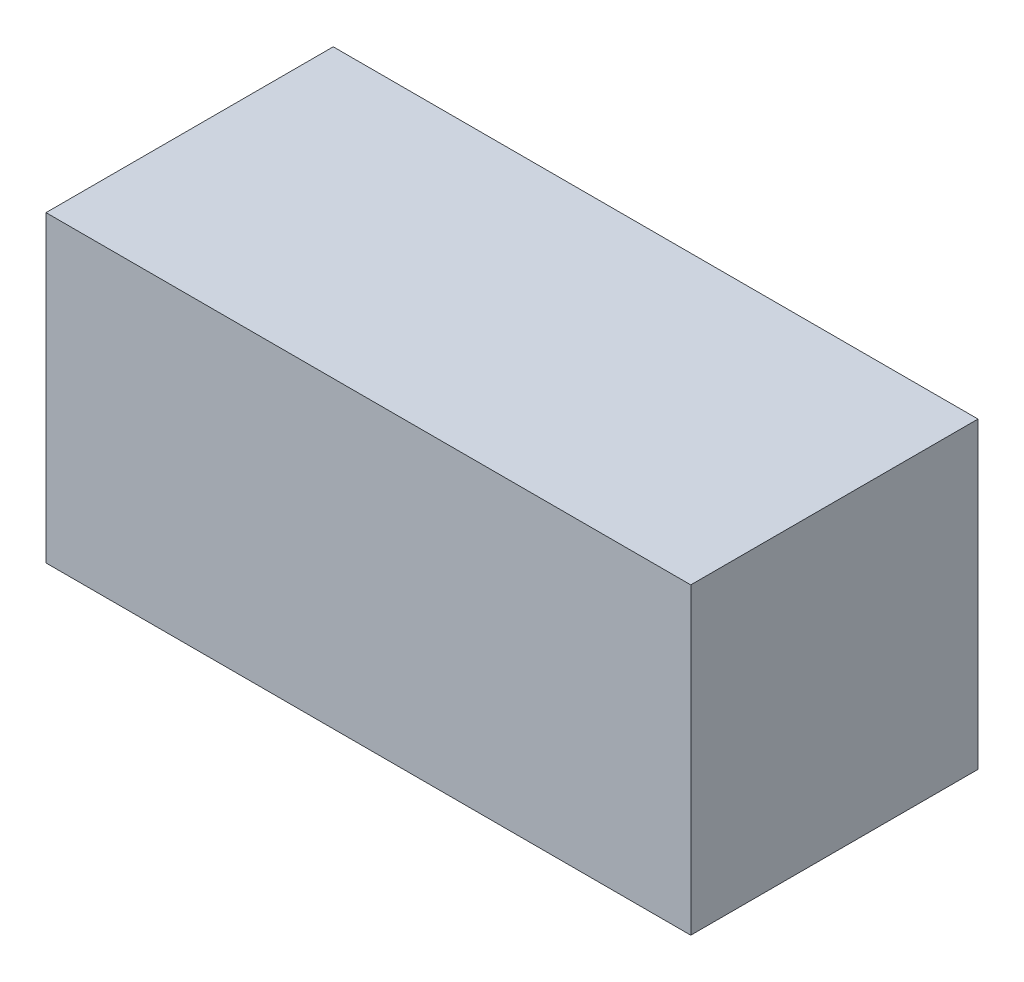
ISO-10303-21;
HEADER;
FILE_DESCRIPTION(('STEP AP214'),'2;1');
FILE_NAME('part.step','',(''),(''),'','','');
FILE_SCHEMA(('AUTOMOTIVE_DESIGN { 1 0 10303 214 1 1 1 1 }'));
ENDSEC;
DATA;
#1=APPLICATION_CONTEXT('core data for automotive mechanical design processes');
#2=APPLICATION_PROTOCOL_DEFINITION('international standard','automotive_design',2000,#1);
#3=PRODUCT_CONTEXT('',#1,'mechanical');
#4=PRODUCT('Part','Part','',(#3));
#5=PRODUCT_RELATED_PRODUCT_CATEGORY('part','',(#4));
#6=PRODUCT_DEFINITION_FORMATION('','',#4);
#7=PRODUCT_DEFINITION_CONTEXT('part definition',#1,'design');
#8=PRODUCT_DEFINITION('design','',#6,#7);
#9=PRODUCT_DEFINITION_SHAPE('','',#8);
#10=(LENGTH_UNIT() NAMED_UNIT(*) SI_UNIT(.MILLI.,.METRE.));
#11=(NAMED_UNIT(*) PLANE_ANGLE_UNIT() SI_UNIT($,.RADIAN.));
#12=(NAMED_UNIT(*) SI_UNIT($,.STERADIAN.) SOLID_ANGLE_UNIT());
#13=UNCERTAINTY_MEASURE_WITH_UNIT(LENGTH_MEASURE(1.E-05),#10,'distance_accuracy_value','');
#14=(GEOMETRIC_REPRESENTATION_CONTEXT(3) GLOBAL_UNCERTAINTY_ASSIGNED_CONTEXT((#13)) GLOBAL_UNIT_ASSIGNED_CONTEXT((#10,
#11,#12)) REPRESENTATION_CONTEXT('',''));
#15=CARTESIAN_POINT('',(0.,0.,0.));
#16=DIRECTION('',(0.,0.,1.));
#17=DIRECTION('',(1.,0.,0.));
#18=AXIS2_PLACEMENT_3D('',#15,#16,#17);
#19=CARTESIAN_POINT('',(80.9625,38.1,72.136));
#20=DIRECTION('',(-1.,0.,0.));
#21=DIRECTION('',(0.,0.,1.));
#22=AXIS2_PLACEMENT_3D('',#19,#20,#21);
#23=PLANE('',#22);
#24=DIRECTION('',(0.,1.,0.));
#25=VECTOR('',#24,1.);
#26=CARTESIAN_POINT('',(80.9625,38.1,0.));
#27=LINE('',#26,#25);
#28=CARTESIAN_POINT('',(80.9625,-38.1,0.));
#29=VERTEX_POINT('',#28);
#30=CARTESIAN_POINT('',(80.9625,38.1,0.));
#31=VERTEX_POINT('',#30);
#32=EDGE_CURVE('E98',#29,#31,#27,.T.);
#33=ORIENTED_EDGE('',*,*,#32,.T.);
#34=DIRECTION('',(0.,0.,-1.));
#35=VECTOR('',#34,1.);
#36=CARTESIAN_POINT('',(80.9625,38.1,72.136));
#37=LINE('',#36,#35);
#38=CARTESIAN_POINT('',(80.9625,38.1,72.136));
#39=VERTEX_POINT('',#38);
#40=EDGE_CURVE('E11',#39,#31,#37,.T.);
#41=ORIENTED_EDGE('',*,*,#40,.F.);
#42=DIRECTION('',(0.,1.,0.));
#43=VECTOR('',#42,1.);
#44=CARTESIAN_POINT('',(80.9625,38.1,72.136));
#45=LINE('',#44,#43);
#46=CARTESIAN_POINT('',(80.9625,-38.1,72.136));
#47=VERTEX_POINT('',#46);
#48=EDGE_CURVE('E86',#47,#39,#45,.T.);
#49=ORIENTED_EDGE('',*,*,#48,.F.);
#50=DIRECTION('',(0.,0.,-1.));
#51=VECTOR('',#50,1.);
#52=CARTESIAN_POINT('',(80.9625,-38.1,72.136));
#53=LINE('',#52,#51);
#54=EDGE_CURVE('E94',#47,#29,#53,.T.);
#55=ORIENTED_EDGE('',*,*,#54,.T.);
#56=EDGE_LOOP('',(#33,#41,#49,#55));
#57=FACE_BOUND('',#56,.T.);
#58=ADVANCED_FACE('F35',(#57),#23,.F.);
#59=CARTESIAN_POINT('',(-80.9625,38.1,72.136));
#60=DIRECTION('',(0.,-1.,0.));
#61=DIRECTION('',(0.,0.,-1.));
#62=AXIS2_PLACEMENT_3D('',#59,#60,#61);
#63=PLANE('',#62);
#64=DIRECTION('',(-1.,0.,0.));
#65=VECTOR('',#64,1.);
#66=CARTESIAN_POINT('',(-80.9625,38.1,0.));
#67=LINE('',#66,#65);
#68=CARTESIAN_POINT('',(-80.9625,38.1,0.));
#69=VERTEX_POINT('',#68);
#70=EDGE_CURVE('E90',#31,#69,#67,.T.);
#71=ORIENTED_EDGE('',*,*,#70,.T.);
#72=DIRECTION('',(0.,0.,-1.));
#73=VECTOR('',#72,1.);
#74=CARTESIAN_POINT('',(-80.9625,38.1,72.136));
#75=LINE('',#74,#73);
#76=CARTESIAN_POINT('',(-80.9625,38.1,72.136));
#77=VERTEX_POINT('',#76);
#78=EDGE_CURVE('E43',#77,#69,#75,.T.);
#79=ORIENTED_EDGE('',*,*,#78,.F.);
#80=DIRECTION('',(-1.,0.,0.));
#81=VECTOR('',#80,1.);
#82=CARTESIAN_POINT('',(-80.9625,38.1,72.136));
#83=LINE('',#82,#81);
#84=EDGE_CURVE('E81',#39,#77,#83,.T.);
#85=ORIENTED_EDGE('',*,*,#84,.F.);
#86=ORIENTED_EDGE('',*,*,#40,.T.);
#87=EDGE_LOOP('',(#71,#79,#85,#86));
#88=FACE_BOUND('',#87,.T.);
#89=ADVANCED_FACE('F89',(#88),#63,.F.);
#90=CARTESIAN_POINT('',(-80.9625,38.1,72.136));
#91=DIRECTION('',(1.,0.,0.));
#92=DIRECTION('',(0.,1.,0.));
#93=AXIS2_PLACEMENT_3D('',#90,#91,#92);
#94=PLANE('',#93);
#95=DIRECTION('',(0.,-1.,0.));
#96=VECTOR('',#95,1.);
#97=CARTESIAN_POINT('',(-80.9625,38.1,0.));
#98=LINE('',#97,#96);
#99=CARTESIAN_POINT('',(-80.9625,-38.1,0.));
#100=VERTEX_POINT('',#99);
#101=EDGE_CURVE('E68',#69,#100,#98,.T.);
#102=ORIENTED_EDGE('',*,*,#101,.T.);
#103=DIRECTION('',(0.,0.,-1.));
#104=VECTOR('',#103,1.);
#105=CARTESIAN_POINT('',(-80.9625,-38.1,72.136));
#106=LINE('',#105,#104);
#107=CARTESIAN_POINT('',(-80.9625,-38.1,72.136));
#108=VERTEX_POINT('',#107);
#109=EDGE_CURVE('E91',#108,#100,#106,.T.);
#110=ORIENTED_EDGE('',*,*,#109,.F.);
#111=DIRECTION('',(0.,-1.,0.));
#112=VECTOR('',#111,1.);
#113=CARTESIAN_POINT('',(-80.9625,38.1,72.136));
#114=LINE('',#113,#112);
#115=EDGE_CURVE('E84',#77,#108,#114,.T.);
#116=ORIENTED_EDGE('',*,*,#115,.F.);
#117=ORIENTED_EDGE('',*,*,#78,.T.);
#118=EDGE_LOOP('',(#102,#110,#116,#117));
#119=FACE_BOUND('',#118,.T.);
#120=ADVANCED_FACE('F92',(#119),#94,.F.);
#121=CARTESIAN_POINT('',(-80.9625,-38.1,72.136));
#122=DIRECTION('',(0.,1.,0.));
#123=DIRECTION('',(0.,0.,1.));
#124=AXIS2_PLACEMENT_3D('',#121,#122,#123);
#125=PLANE('',#124);
#126=DIRECTION('',(1.,0.,0.));
#127=VECTOR('',#126,1.);
#128=CARTESIAN_POINT('',(-80.9625,-38.1,0.));
#129=LINE('',#128,#127);
#130=EDGE_CURVE('E74',#100,#29,#129,.T.);
#131=ORIENTED_EDGE('',*,*,#130,.T.);
#132=ORIENTED_EDGE('',*,*,#54,.F.);
#133=DIRECTION('',(1.,0.,0.));
#134=VECTOR('',#133,1.);
#135=CARTESIAN_POINT('',(-80.9625,-38.1,72.136));
#136=LINE('',#135,#134);
#137=EDGE_CURVE('E51',#108,#47,#136,.T.);
#138=ORIENTED_EDGE('',*,*,#137,.F.);
#139=ORIENTED_EDGE('',*,*,#109,.T.);
#140=EDGE_LOOP('',(#131,#132,#138,#139));
#141=FACE_BOUND('',#140,.T.);
#142=ADVANCED_FACE('F105',(#141),#125,.F.);
#143=CARTESIAN_POINT('',(0.,0.,72.136));
#144=DIRECTION('',(0.,0.,1.));
#145=DIRECTION('',(1.,0.,0.));
#146=AXIS2_PLACEMENT_3D('',#143,#144,#145);
#147=PLANE('',#146);
#148=ORIENTED_EDGE('',*,*,#48,.T.);
#149=ORIENTED_EDGE('',*,*,#84,.T.);
#150=ORIENTED_EDGE('',*,*,#115,.T.);
#151=ORIENTED_EDGE('',*,*,#137,.T.);
#152=EDGE_LOOP('',(#148,#149,#150,#151));
#153=FACE_BOUND('',#152,.T.);
#154=ADVANCED_FACE('F82',(#153),#147,.T.);
#155=CARTESIAN_POINT('',(0.,0.,0.));
#156=DIRECTION('',(0.,0.,1.));
#157=DIRECTION('',(1.,0.,0.));
#158=AXIS2_PLACEMENT_3D('',#155,#156,#157);
#159=PLANE('',#158);
#160=ORIENTED_EDGE('',*,*,#32,.F.);
#161=ORIENTED_EDGE('',*,*,#130,.F.);
#162=ORIENTED_EDGE('',*,*,#101,.F.);
#163=ORIENTED_EDGE('',*,*,#70,.F.);
#164=EDGE_LOOP('',(#160,#161,#162,#163));
#165=FACE_BOUND('',#164,.T.);
#166=ADVANCED_FACE('F108',(#165),#159,.F.);
#167=CLOSED_SHELL('',(#58,#89,#120,#142,#154,#166));
#168=MANIFOLD_SOLID_BREP('B2',#167);
#169=ADVANCED_BREP_SHAPE_REPRESENTATION('',(#18,#168),#14);
#170=SHAPE_DEFINITION_REPRESENTATION(#9,#169);
ENDSEC;
END-ISO-10303-21;
